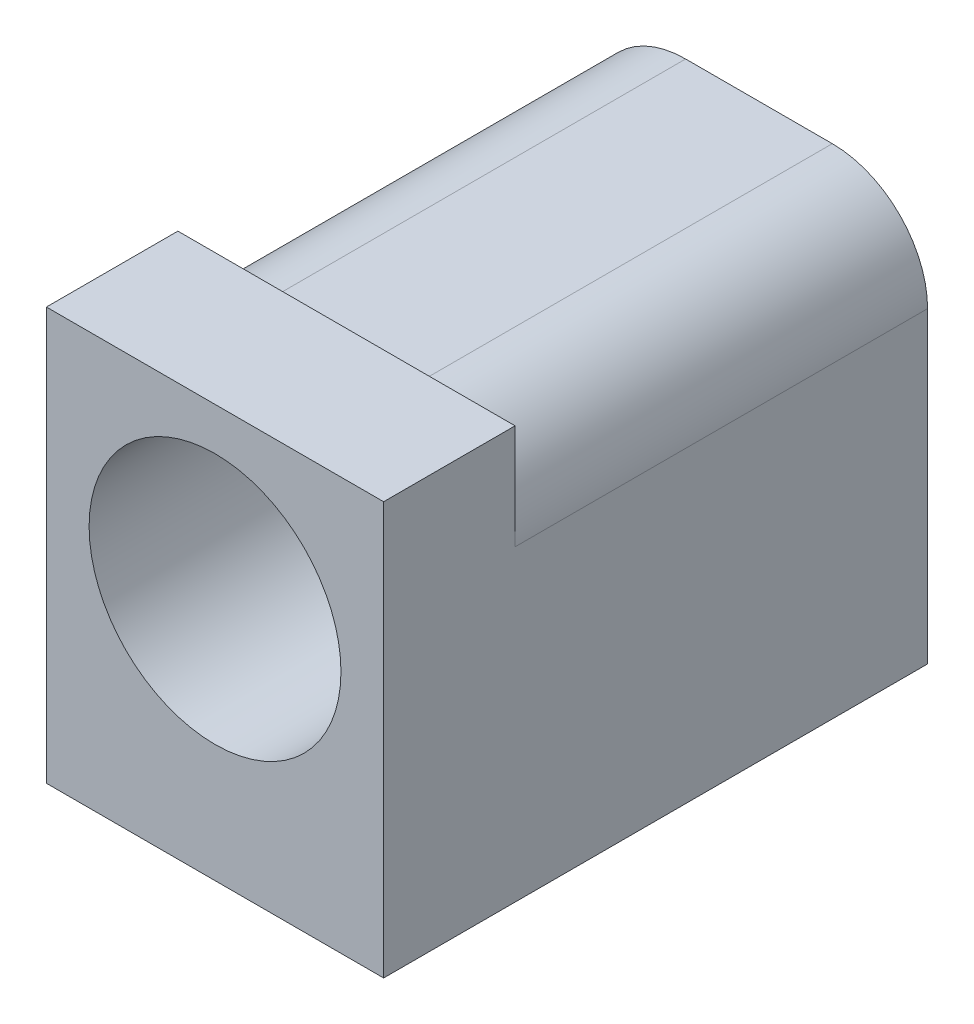
ISO-10303-21;
HEADER;
FILE_DESCRIPTION(('STEP AP214'),'2;1');
FILE_NAME('part.step','',(''),(''),'','','');
FILE_SCHEMA(('AUTOMOTIVE_DESIGN { 1 0 10303 214 1 1 1 1 }'));
ENDSEC;
DATA;
#1=APPLICATION_CONTEXT('core data for automotive mechanical design processes');
#2=APPLICATION_PROTOCOL_DEFINITION('international standard','automotive_design',2000,#1);
#3=PRODUCT_CONTEXT('',#1,'mechanical');
#4=PRODUCT('Part','Part','',(#3));
#5=PRODUCT_RELATED_PRODUCT_CATEGORY('part','',(#4));
#6=PRODUCT_DEFINITION_FORMATION('','',#4);
#7=PRODUCT_DEFINITION_CONTEXT('part definition',#1,'design');
#8=PRODUCT_DEFINITION('design','',#6,#7);
#9=PRODUCT_DEFINITION_SHAPE('','',#8);
#10=(LENGTH_UNIT() NAMED_UNIT(*) SI_UNIT(.MILLI.,.METRE.));
#11=(NAMED_UNIT(*) PLANE_ANGLE_UNIT() SI_UNIT($,.RADIAN.));
#12=(NAMED_UNIT(*) SI_UNIT($,.STERADIAN.) SOLID_ANGLE_UNIT());
#13=UNCERTAINTY_MEASURE_WITH_UNIT(LENGTH_MEASURE(1.E-05),#10,'distance_accuracy_value','');
#14=(GEOMETRIC_REPRESENTATION_CONTEXT(3) GLOBAL_UNCERTAINTY_ASSIGNED_CONTEXT((#13)) GLOBAL_UNIT_ASSIGNED_CONTEXT((#10,
#11,#12)) REPRESENTATION_CONTEXT('',''));
#15=CARTESIAN_POINT('',(0.,0.,0.));
#16=DIRECTION('',(0.,0.,1.));
#17=DIRECTION('',(1.,0.,0.));
#18=AXIS2_PLACEMENT_3D('',#15,#16,#17);
#19=CARTESIAN_POINT('',(0.,10.9982,-14.5034));
#20=DIRECTION('',(0.,0.,1.));
#21=DIRECTION('',(1.,0.,0.));
#22=AXIS2_PLACEMENT_3D('',#19,#20,#21);
#23=PLANE('',#22);
#24=DIRECTION('',(0.,-1.,0.));
#25=VECTOR('',#24,1.);
#26=CARTESIAN_POINT('',(0.,10.9982,-14.5034));
#27=LINE('',#26,#25);
#28=CARTESIAN_POINT('',(0.,8.2042,-14.5034));
#29=VERTEX_POINT('',#28);
#30=CARTESIAN_POINT('',(0.,0.,-14.5034));
#31=VERTEX_POINT('',#30);
#32=EDGE_CURVE('E120',#29,#31,#27,.T.);
#33=ORIENTED_EDGE('',*,*,#32,.F.);
#34=CARTESIAN_POINT('',(2.54,8.2042,-14.5034));
#35=DIRECTION('',(0.,0.,1.));
#36=DIRECTION('',(1.,0.,0.));
#37=AXIS2_PLACEMENT_3D('',#34,#35,#36);
#38=CIRCLE('',#37,2.54);
#39=CARTESIAN_POINT('',(2.54,10.7442,-14.5034));
#40=VERTEX_POINT('',#39);
#41=EDGE_CURVE('E41',#29,#40,#38,.F.);
#42=ORIENTED_EDGE('',*,*,#41,.T.);
#43=DIRECTION('',(-1.,0.,0.));
#44=VECTOR('',#43,1.);
#45=CARTESIAN_POINT('',(0.,10.7442,-14.5034));
#46=LINE('',#45,#44);
#47=CARTESIAN_POINT('',(6.4516,10.7442,-14.5034));
#48=VERTEX_POINT('',#47);
#49=EDGE_CURVE('E161',#48,#40,#46,.T.);
#50=ORIENTED_EDGE('',*,*,#49,.F.);
#51=CARTESIAN_POINT('',(6.4516,8.2042,-14.5034));
#52=DIRECTION('',(0.,0.,1.));
#53=DIRECTION('',(1.,0.,0.));
#54=AXIS2_PLACEMENT_3D('',#51,#52,#53);
#55=CIRCLE('',#54,2.54);
#56=CARTESIAN_POINT('',(8.9916,8.2042,-14.5034));
#57=VERTEX_POINT('',#56);
#58=EDGE_CURVE('E149',#48,#57,#55,.F.);
#59=ORIENTED_EDGE('',*,*,#58,.T.);
#60=DIRECTION('',(0.,-1.,0.));
#61=VECTOR('',#60,1.);
#62=CARTESIAN_POINT('',(8.9916,10.9982,-14.5034));
#63=LINE('',#62,#61);
#64=CARTESIAN_POINT('',(8.9916,0.,-14.5034));
#65=VERTEX_POINT('',#64);
#66=EDGE_CURVE('E122',#57,#65,#63,.T.);
#67=ORIENTED_EDGE('',*,*,#66,.T.);
#68=DIRECTION('',(-1.,0.,0.));
#69=VECTOR('',#68,1.);
#70=CARTESIAN_POINT('',(0.,0.,-14.5034));
#71=LINE('',#70,#69);
#72=EDGE_CURVE('E137',#65,#31,#71,.T.);
#73=ORIENTED_EDGE('',*,*,#72,.T.);
#74=EDGE_LOOP('',(#33,#42,#50,#59,#67,#73));
#75=FACE_BOUND('',#74,.T.);
#76=ADVANCED_FACE('F33',(#75),#23,.F.);
#77=CARTESIAN_POINT('',(0.,10.9982,0.));
#78=DIRECTION('',(1.,0.,0.));
#79=DIRECTION('',(0.,0.,-1.));
#80=AXIS2_PLACEMENT_3D('',#77,#78,#79);
#81=PLANE('',#80);
#82=DIRECTION('',(0.,1.,0.));
#83=VECTOR('',#82,1.);
#84=CARTESIAN_POINT('',(0.,10.7442,-3.5052));
#85=LINE('',#84,#83);
#86=CARTESIAN_POINT('',(0.,8.2042,-3.5052));
#87=VERTEX_POINT('',#86);
#88=CARTESIAN_POINT('',(0.,10.9982,-3.5052));
#89=VERTEX_POINT('',#88);
#90=EDGE_CURVE('E48',#87,#89,#85,.T.);
#91=ORIENTED_EDGE('',*,*,#90,.F.);
#92=DIRECTION('',(0.,0.,1.));
#93=VECTOR('',#92,1.);
#94=CARTESIAN_POINT('',(0.,8.2042,-14.5034));
#95=LINE('',#94,#93);
#96=EDGE_CURVE('E52',#87,#29,#95,.F.);
#97=ORIENTED_EDGE('',*,*,#96,.T.);
#98=ORIENTED_EDGE('',*,*,#32,.T.);
#99=DIRECTION('',(0.,0.,1.));
#100=VECTOR('',#99,1.);
#101=CARTESIAN_POINT('',(0.,0.,0.));
#102=LINE('',#101,#100);
#103=CARTESIAN_POINT('',(0.,0.,0.));
#104=VERTEX_POINT('',#103);
#105=EDGE_CURVE('E128',#31,#104,#102,.T.);
#106=ORIENTED_EDGE('',*,*,#105,.T.);
#107=DIRECTION('',(0.,-1.,0.));
#108=VECTOR('',#107,1.);
#109=CARTESIAN_POINT('',(0.,10.9982,0.));
#110=LINE('',#109,#108);
#111=CARTESIAN_POINT('',(0.,10.9982,0.));
#112=VERTEX_POINT('',#111);
#113=EDGE_CURVE('E143',#112,#104,#110,.T.);
#114=ORIENTED_EDGE('',*,*,#113,.F.);
#115=DIRECTION('',(0.,0.,1.));
#116=VECTOR('',#115,1.);
#117=CARTESIAN_POINT('',(0.,10.9982,0.));
#118=LINE('',#117,#116);
#119=EDGE_CURVE('E124',#89,#112,#118,.T.);
#120=ORIENTED_EDGE('',*,*,#119,.F.);
#121=EDGE_LOOP('',(#91,#97,#98,#106,#114,#120));
#122=FACE_BOUND('',#121,.T.);
#123=ADVANCED_FACE('F178',(#122),#81,.F.);
#124=CARTESIAN_POINT('',(0.,10.9982,0.));
#125=DIRECTION('',(0.,0.,-1.));
#126=DIRECTION('',(-1.,0.,0.));
#127=AXIS2_PLACEMENT_3D('',#124,#125,#126);
#128=PLANE('',#127);
#129=CARTESIAN_POINT('',(4.4958,6.5024,0.));
#130=DIRECTION('',(0.,0.,1.));
#131=DIRECTION('',(1.,0.,0.));
#132=AXIS2_PLACEMENT_3D('',#129,#130,#131);
#133=CIRCLE('',#132,3.35774014368208);
#134=CARTESIAN_POINT('',(7.85354014368208,6.5024,0.));
#135=VERTEX_POINT('',#134);
#136=EDGE_CURVE('E114',#135,#135,#133,.T.);
#137=ORIENTED_EDGE('',*,*,#136,.F.);
#138=EDGE_LOOP('',(#137));
#139=FACE_BOUND('',#138,.T.);
#140=DIRECTION('',(1.,0.,0.));
#141=VECTOR('',#140,1.);
#142=CARTESIAN_POINT('',(0.,0.,0.));
#143=LINE('',#142,#141);
#144=CARTESIAN_POINT('',(8.9916,0.,0.));
#145=VERTEX_POINT('',#144);
#146=EDGE_CURVE('E131',#104,#145,#143,.T.);
#147=ORIENTED_EDGE('',*,*,#146,.T.);
#148=DIRECTION('',(0.,-1.,0.));
#149=VECTOR('',#148,1.);
#150=CARTESIAN_POINT('',(8.9916,10.9982,0.));
#151=LINE('',#150,#149);
#152=CARTESIAN_POINT('',(8.9916,10.9982,0.));
#153=VERTEX_POINT('',#152);
#154=EDGE_CURVE('E141',#153,#145,#151,.T.);
#155=ORIENTED_EDGE('',*,*,#154,.F.);
#156=DIRECTION('',(1.,0.,0.));
#157=VECTOR('',#156,1.);
#158=CARTESIAN_POINT('',(0.,10.9982,0.));
#159=LINE('',#158,#157);
#160=EDGE_CURVE('E118',#112,#153,#159,.T.);
#161=ORIENTED_EDGE('',*,*,#160,.F.);
#162=ORIENTED_EDGE('',*,*,#113,.T.);
#163=EDGE_LOOP('',(#147,#155,#161,#162));
#164=FACE_BOUND('',#163,.T.);
#165=ADVANCED_FACE('F177',(#139,#164),#128,.F.);
#166=CARTESIAN_POINT('',(8.9916,10.9982,0.));
#167=DIRECTION('',(-1.,0.,0.));
#168=DIRECTION('',(0.,0.,1.));
#169=AXIS2_PLACEMENT_3D('',#166,#167,#168);
#170=PLANE('',#169);
#171=ORIENTED_EDGE('',*,*,#66,.F.);
#172=DIRECTION('',(0.,0.,-1.));
#173=VECTOR('',#172,1.);
#174=CARTESIAN_POINT('',(8.9916,8.2042,-3.5052));
#175=LINE('',#174,#173);
#176=CARTESIAN_POINT('',(8.9916,8.2042,-3.5052));
#177=VERTEX_POINT('',#176);
#178=EDGE_CURVE('E112',#57,#177,#175,.F.);
#179=ORIENTED_EDGE('',*,*,#178,.T.);
#180=DIRECTION('',(0.,1.,0.));
#181=VECTOR('',#180,1.);
#182=CARTESIAN_POINT('',(8.9916,10.7442,-3.5052));
#183=LINE('',#182,#181);
#184=CARTESIAN_POINT('',(8.9916,10.9982,-3.5052));
#185=VERTEX_POINT('',#184);
#186=EDGE_CURVE('E99',#177,#185,#183,.T.);
#187=ORIENTED_EDGE('',*,*,#186,.T.);
#188=DIRECTION('',(0.,0.,-1.));
#189=VECTOR('',#188,1.);
#190=CARTESIAN_POINT('',(8.9916,10.9982,0.));
#191=LINE('',#190,#189);
#192=EDGE_CURVE('E110',#153,#185,#191,.T.);
#193=ORIENTED_EDGE('',*,*,#192,.F.);
#194=ORIENTED_EDGE('',*,*,#154,.T.);
#195=DIRECTION('',(0.,0.,-1.));
#196=VECTOR('',#195,1.);
#197=CARTESIAN_POINT('',(8.9916,0.,0.));
#198=LINE('',#197,#196);
#199=EDGE_CURVE('E134',#145,#65,#198,.T.);
#200=ORIENTED_EDGE('',*,*,#199,.T.);
#201=EDGE_LOOP('',(#171,#179,#187,#193,#194,#200));
#202=FACE_BOUND('',#201,.T.);
#203=ADVANCED_FACE('F108',(#202),#170,.F.);
#204=CARTESIAN_POINT('',(0.,10.9982,-14.5034));
#205=DIRECTION('',(0.,-1.,0.));
#206=DIRECTION('',(0.,0.,-1.));
#207=AXIS2_PLACEMENT_3D('',#204,#205,#206);
#208=PLANE('',#207);
#209=ORIENTED_EDGE('',*,*,#192,.T.);
#210=DIRECTION('',(1.,0.,0.));
#211=VECTOR('',#210,1.);
#212=CARTESIAN_POINT('',(0.,10.9982,-3.5052));
#213=LINE('',#212,#211);
#214=EDGE_CURVE('E95',#89,#185,#213,.T.);
#215=ORIENTED_EDGE('',*,*,#214,.F.);
#216=ORIENTED_EDGE('',*,*,#119,.T.);
#217=ORIENTED_EDGE('',*,*,#160,.T.);
#218=EDGE_LOOP('',(#209,#215,#216,#217));
#219=FACE_BOUND('',#218,.T.);
#220=ADVANCED_FACE('F116',(#219),#208,.F.);
#221=CARTESIAN_POINT('',(0.,0.,-14.5034));
#222=DIRECTION('',(0.,-1.,0.));
#223=DIRECTION('',(0.,0.,-1.));
#224=AXIS2_PLACEMENT_3D('',#221,#222,#223);
#225=PLANE('',#224);
#226=ORIENTED_EDGE('',*,*,#105,.F.);
#227=ORIENTED_EDGE('',*,*,#72,.F.);
#228=ORIENTED_EDGE('',*,*,#199,.F.);
#229=ORIENTED_EDGE('',*,*,#146,.F.);
#230=EDGE_LOOP('',(#226,#227,#228,#229));
#231=FACE_BOUND('',#230,.T.);
#232=ADVANCED_FACE('F182',(#231),#225,.T.);
#233=CARTESIAN_POINT('',(4.4958,6.5024,-11.43));
#234=DIRECTION('',(0.,0.,1.));
#235=DIRECTION('',(1.,0.,0.));
#236=AXIS2_PLACEMENT_3D('',#233,#234,#235);
#237=CYLINDRICAL_SURFACE('',#236,3.35774014368208);
#238=CARTESIAN_POINT('',(4.4958,6.5024,-11.43));
#239=DIRECTION('',(0.,0.,1.));
#240=DIRECTION('',(1.,0.,0.));
#241=AXIS2_PLACEMENT_3D('',#238,#239,#240);
#242=CIRCLE('',#241,3.35774014368208);
#243=CARTESIAN_POINT('',(7.85354014368208,6.5024,-11.43));
#244=VERTEX_POINT('',#243);
#245=EDGE_CURVE('E132',#244,#244,#242,.T.);
#246=ORIENTED_EDGE('',*,*,#245,.F.);
#247=EDGE_LOOP('',(#246));
#248=FACE_BOUND('',#247,.T.);
#249=ORIENTED_EDGE('',*,*,#136,.T.);
#250=EDGE_LOOP('',(#249));
#251=FACE_BOUND('',#250,.T.);
#252=ADVANCED_FACE('F209',(#248,#251),#237,.F.);
#253=CARTESIAN_POINT('',(4.4958,6.5024,-11.43));
#254=DIRECTION('',(0.,0.,1.));
#255=DIRECTION('',(1.,0.,0.));
#256=AXIS2_PLACEMENT_3D('',#253,#254,#255);
#257=PLANE('',#256);
#258=ORIENTED_EDGE('',*,*,#245,.T.);
#259=EDGE_LOOP('',(#258));
#260=FACE_BOUND('',#259,.T.);
#261=ADVANCED_FACE('F211',(#260),#257,.T.);
#262=CARTESIAN_POINT('',(0.,10.7442,-3.5052));
#263=DIRECTION('',(0.,0.,1.));
#264=DIRECTION('',(1.,0.,0.));
#265=AXIS2_PLACEMENT_3D('',#262,#263,#264);
#266=PLANE('',#265);
#267=ORIENTED_EDGE('',*,*,#214,.T.);
#268=ORIENTED_EDGE('',*,*,#186,.F.);
#269=CARTESIAN_POINT('',(6.4516,8.2042,-3.5052));
#270=DIRECTION('',(0.,0.,1.));
#271=DIRECTION('',(1.,0.,0.));
#272=AXIS2_PLACEMENT_3D('',#269,#270,#271);
#273=CIRCLE('',#272,2.54);
#274=CARTESIAN_POINT('',(6.4516,10.7442,-3.5052));
#275=VERTEX_POINT('',#274);
#276=EDGE_CURVE('E152',#177,#275,#273,.T.);
#277=ORIENTED_EDGE('',*,*,#276,.T.);
#278=DIRECTION('',(1.,0.,0.));
#279=VECTOR('',#278,1.);
#280=CARTESIAN_POINT('',(0.,10.7442,-3.5052));
#281=LINE('',#280,#279);
#282=CARTESIAN_POINT('',(2.54,10.7442,-3.5052));
#283=VERTEX_POINT('',#282);
#284=EDGE_CURVE('E103',#283,#275,#281,.T.);
#285=ORIENTED_EDGE('',*,*,#284,.F.);
#286=CARTESIAN_POINT('',(2.54,8.2042,-3.5052));
#287=DIRECTION('',(0.,0.,1.));
#288=DIRECTION('',(1.,0.,0.));
#289=AXIS2_PLACEMENT_3D('',#286,#287,#288);
#290=CIRCLE('',#289,2.54);
#291=EDGE_CURVE('E11',#283,#87,#290,.T.);
#292=ORIENTED_EDGE('',*,*,#291,.T.);
#293=ORIENTED_EDGE('',*,*,#90,.T.);
#294=EDGE_LOOP('',(#267,#268,#277,#285,#292,#293));
#295=FACE_BOUND('',#294,.T.);
#296=ADVANCED_FACE('F97',(#295),#266,.F.);
#297=CARTESIAN_POINT('',(0.,10.7442,-3.5052));
#298=DIRECTION('',(0.,1.,0.));
#299=DIRECTION('',(0.,0.,1.));
#300=AXIS2_PLACEMENT_3D('',#297,#298,#299);
#301=PLANE('',#300);
#302=ORIENTED_EDGE('',*,*,#49,.T.);
#303=DIRECTION('',(0.,0.,1.));
#304=VECTOR('',#303,1.);
#305=CARTESIAN_POINT('',(2.54,10.7442,-3.5052));
#306=LINE('',#305,#304);
#307=EDGE_CURVE('E154',#40,#283,#306,.T.);
#308=ORIENTED_EDGE('',*,*,#307,.T.);
#309=ORIENTED_EDGE('',*,*,#284,.T.);
#310=DIRECTION('',(0.,0.,-1.));
#311=VECTOR('',#310,1.);
#312=CARTESIAN_POINT('',(6.4516,10.7442,-14.5034));
#313=LINE('',#312,#311);
#314=EDGE_CURVE('E146',#275,#48,#313,.T.);
#315=ORIENTED_EDGE('',*,*,#314,.T.);
#316=EDGE_LOOP('',(#302,#308,#309,#315));
#317=FACE_BOUND('',#316,.T.);
#318=ADVANCED_FACE('F165',(#317),#301,.T.);
#319=CARTESIAN_POINT('',(6.4516,8.2042,-3.5052));
#320=DIRECTION('',(0.,0.,1.));
#321=DIRECTION('',(1.,0.,0.));
#322=AXIS2_PLACEMENT_3D('',#319,#320,#321);
#323=CYLINDRICAL_SURFACE('',#322,2.54);
#324=ORIENTED_EDGE('',*,*,#276,.F.);
#325=ORIENTED_EDGE('',*,*,#178,.F.);
#326=ORIENTED_EDGE('',*,*,#58,.F.);
#327=ORIENTED_EDGE('',*,*,#314,.F.);
#328=EDGE_LOOP('',(#324,#325,#326,#327));
#329=FACE_BOUND('',#328,.T.);
#330=ADVANCED_FACE('F185',(#329),#323,.T.);
#331=CARTESIAN_POINT('',(2.54,8.2042,-3.5052));
#332=DIRECTION('',(0.,0.,-1.));
#333=DIRECTION('',(-1.,0.,0.));
#334=AXIS2_PLACEMENT_3D('',#331,#332,#333);
#335=CYLINDRICAL_SURFACE('',#334,2.54);
#336=ORIENTED_EDGE('',*,*,#41,.F.);
#337=ORIENTED_EDGE('',*,*,#96,.F.);
#338=ORIENTED_EDGE('',*,*,#291,.F.);
#339=ORIENTED_EDGE('',*,*,#307,.F.);
#340=EDGE_LOOP('',(#336,#337,#338,#339));
#341=FACE_BOUND('',#340,.T.);
#342=ADVANCED_FACE('F35',(#341),#335,.T.);
#343=CLOSED_SHELL('',(#76,#123,#165,#203,#220,#232,#252,#261,#296,#318,#330,#342));
#344=MANIFOLD_SOLID_BREP('B2',#343);
#345=ADVANCED_BREP_SHAPE_REPRESENTATION('',(#18,#344),#14);
#346=SHAPE_DEFINITION_REPRESENTATION(#9,#345);
ENDSEC;
END-ISO-10303-21;
